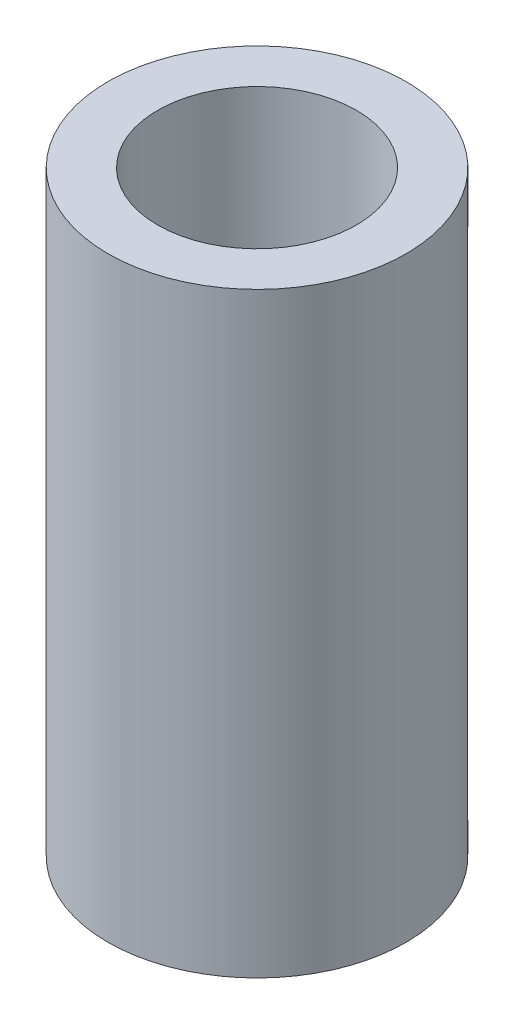
ISO-10303-21;
HEADER;
FILE_DESCRIPTION(('STEP AP214'),'2;1');
FILE_NAME('part.step','',(''),(''),'','','');
FILE_SCHEMA(('AUTOMOTIVE_DESIGN { 1 0 10303 214 1 1 1 1 }'));
ENDSEC;
DATA;
#1=APPLICATION_CONTEXT('core data for automotive mechanical design processes');
#2=APPLICATION_PROTOCOL_DEFINITION('international standard','automotive_design',2000,#1);
#3=PRODUCT_CONTEXT('',#1,'mechanical');
#4=PRODUCT('Part','Part','',(#3));
#5=PRODUCT_RELATED_PRODUCT_CATEGORY('part','',(#4));
#6=PRODUCT_DEFINITION_FORMATION('','',#4);
#7=PRODUCT_DEFINITION_CONTEXT('part definition',#1,'design');
#8=PRODUCT_DEFINITION('design','',#6,#7);
#9=PRODUCT_DEFINITION_SHAPE('','',#8);
#10=(LENGTH_UNIT() NAMED_UNIT(*) SI_UNIT(.MILLI.,.METRE.));
#11=(NAMED_UNIT(*) PLANE_ANGLE_UNIT() SI_UNIT($,.RADIAN.));
#12=(NAMED_UNIT(*) SI_UNIT($,.STERADIAN.) SOLID_ANGLE_UNIT());
#13=UNCERTAINTY_MEASURE_WITH_UNIT(LENGTH_MEASURE(1.E-05),#10,'distance_accuracy_value','');
#14=(GEOMETRIC_REPRESENTATION_CONTEXT(3) GLOBAL_UNCERTAINTY_ASSIGNED_CONTEXT((#13)) GLOBAL_UNIT_ASSIGNED_CONTEXT((#10,
#11,#12)) REPRESENTATION_CONTEXT('',''));
#15=CARTESIAN_POINT('',(0.,0.,0.));
#16=DIRECTION('',(0.,0.,1.));
#17=DIRECTION('',(1.,0.,0.));
#18=AXIS2_PLACEMENT_3D('',#15,#16,#17);
#19=CARTESIAN_POINT('',(0.,18.,0.));
#20=DIRECTION('',(0.,1.,0.));
#21=DIRECTION('',(0.,0.,1.));
#22=AXIS2_PLACEMENT_3D('',#19,#20,#21);
#23=PLANE('',#22);
#24=CARTESIAN_POINT('',(0.,18.,0.));
#25=DIRECTION('',(0.,1.,0.));
#26=DIRECTION('',(0.,0.,1.));
#27=AXIS2_PLACEMENT_3D('',#24,#25,#26);
#28=CIRCLE('',#27,4.5);
#29=CARTESIAN_POINT('',(0.,18.,4.5));
#30=VERTEX_POINT('',#29);
#31=EDGE_CURVE('E52',#30,#30,#28,.T.);
#32=ORIENTED_EDGE('',*,*,#31,.T.);
#33=EDGE_LOOP('',(#32));
#34=FACE_BOUND('',#33,.T.);
#35=CARTESIAN_POINT('',(0.,18.,0.));
#36=DIRECTION('',(0.,1.,0.));
#37=DIRECTION('',(0.,0.,1.));
#38=AXIS2_PLACEMENT_3D('',#35,#36,#37);
#39=CIRCLE('',#38,3.);
#40=CARTESIAN_POINT('',(0.,18.,3.));
#41=VERTEX_POINT('',#40);
#42=EDGE_CURVE('E60',#41,#41,#39,.T.);
#43=ORIENTED_EDGE('',*,*,#42,.F.);
#44=EDGE_LOOP('',(#43));
#45=FACE_BOUND('',#44,.T.);
#46=ADVANCED_FACE('F34',(#34,#45),#23,.T.);
#47=CARTESIAN_POINT('',(0.,0.,0.));
#48=DIRECTION('',(0.,1.,0.));
#49=DIRECTION('',(0.,0.,1.));
#50=AXIS2_PLACEMENT_3D('',#47,#48,#49);
#51=PLANE('',#50);
#52=CARTESIAN_POINT('',(0.,0.,0.));
#53=DIRECTION('',(0.,1.,0.));
#54=DIRECTION('',(0.,0.,1.));
#55=AXIS2_PLACEMENT_3D('',#52,#53,#54);
#56=CIRCLE('',#55,4.5);
#57=CARTESIAN_POINT('',(0.,0.,4.5));
#58=VERTEX_POINT('',#57);
#59=EDGE_CURVE('E67',#58,#58,#56,.T.);
#60=ORIENTED_EDGE('',*,*,#59,.F.);
#61=EDGE_LOOP('',(#60));
#62=FACE_BOUND('',#61,.T.);
#63=CARTESIAN_POINT('',(0.,0.,0.));
#64=DIRECTION('',(0.,1.,0.));
#65=DIRECTION('',(0.,0.,1.));
#66=AXIS2_PLACEMENT_3D('',#63,#64,#65);
#67=CIRCLE('',#66,3.);
#68=CARTESIAN_POINT('',(0.,0.,3.));
#69=VERTEX_POINT('',#68);
#70=EDGE_CURVE('E63',#69,#69,#67,.T.);
#71=ORIENTED_EDGE('',*,*,#70,.T.);
#72=EDGE_LOOP('',(#71));
#73=FACE_BOUND('',#72,.T.);
#74=ADVANCED_FACE('F78',(#62,#73),#51,.F.);
#75=CARTESIAN_POINT('',(0.,18.,0.));
#76=DIRECTION('',(0.,-1.,0.));
#77=DIRECTION('',(0.,0.,-1.));
#78=AXIS2_PLACEMENT_3D('',#75,#76,#77);
#79=CYLINDRICAL_SURFACE('',#78,4.5);
#80=CARTESIAN_POINT('',(0.,9.,-4.5));
#81=CARTESIAN_POINT('',(-0.15072164959947,8.99999813426493,-4.49999851870946));
#82=CARTESIAN_POINT('',(-0.301452176851333,8.98857832417678,-4.49236147696477));
#83=CARTESIAN_POINT('',(-0.59810104158593,8.94360542507381,-4.46257035096117));
#84=CARTESIAN_POINT('',(-0.74401705991098,8.91004182818988,-4.44040937470719));
#85=CARTESIAN_POINT('',(-1.02631807461021,8.82283823203407,-4.38375708578349));
#86=CARTESIAN_POINT('',(-1.16274420495288,8.76929223840315,-4.34932354201735));
#87=CARTESIAN_POINT('',(-1.42412304054445,8.64440500668519,-4.27089210854984));
#88=CARTESIAN_POINT('',(-1.54907407635533,8.57306118489946,-4.22689283031654));
#89=CARTESIAN_POINT('',(-1.7959270197585,8.40801457838083,-4.1284099283604));
#90=CARTESIAN_POINT('',(-1.91667044973221,8.31292820469136,-4.0733534604063));
#91=CARTESIAN_POINT('',(-2.14159207551014,8.10640493121269,-3.95973469954022));
#92=CARTESIAN_POINT('',(-2.24574608557945,7.99494460644394,-3.90116745629249));
#93=CARTESIAN_POINT('',(-2.45133446337936,7.73842144719105,-3.7759239690936));
#94=CARTESIAN_POINT('',(-2.54974779469906,7.59083151982669,-3.70942601877786));
#95=CARTESIAN_POINT('',(-2.72025535595352,7.2774549338977,-3.58626221058086));
#96=CARTESIAN_POINT('',(-2.79239510156523,7.11170039773947,-3.52957943938873));
#97=CARTESIAN_POINT('',(-2.8901105250523,6.81493305980811,-3.44964399957303));
#98=CARTESIAN_POINT('',(-2.92311670850673,6.68770732067158,-3.42146441836474));
#99=CARTESIAN_POINT('',(-2.97225926681176,6.42788324290506,-3.37886954491533));
#100=CARTESIAN_POINT('',(-2.9884247197938,6.29529457692171,-3.36443053119849));
#101=CARTESIAN_POINT('',(-3.002870462104,6.02778783170445,-3.35154908408425));
#102=CARTESIAN_POINT('',(-3.00107764373871,5.89286246479561,-3.35317203825297));
#103=CARTESIAN_POINT('',(-2.97956372002451,5.62554753977618,-3.37229663237604));
#104=CARTESIAN_POINT('',(-2.95982742578818,5.49316022705024,-3.3898117247656));
#105=CARTESIAN_POINT('',(-2.90497491317742,5.24029942303126,-3.43690778941067));
#106=CARTESIAN_POINT('',(-2.87057567189679,5.11955799573548,-3.46592232325882));
#107=CARTESIAN_POINT('',(-2.78805177845537,4.88546446318416,-3.53264434237926));
#108=CARTESIAN_POINT('',(-2.73992260984511,4.77211480454443,-3.57035468734855));
#109=CARTESIAN_POINT('',(-2.62010728109712,4.53146190709751,-3.65946294623512));
#110=CARTESIAN_POINT('',(-2.54562078453565,4.40601014931102,-3.7120847662621));
#111=CARTESIAN_POINT('',(-2.3800344065443,4.16792490703567,-3.82037306584868));
#112=CARTESIAN_POINT('',(-2.28891403498575,4.05530751334647,-3.8760432405953));
#113=CARTESIAN_POINT('',(-2.06971747984492,3.82118618160754,-3.9981501565101));
#114=CARTESIAN_POINT('',(-1.93790907425758,3.70299892697923,-4.06432117082282));
#115=CARTESIAN_POINT('',(-1.65301199861739,3.49020525818891,-4.18827150996376));
#116=CARTESIAN_POINT('',(-1.49994344901489,3.39557678188572,-4.24605866471716));
#117=CARTESIAN_POINT('',(-1.20728674064533,3.24978342206635,-4.33718106135825));
#118=CARTESIAN_POINT('',(-1.07093646505801,3.19373495499177,-4.37308891748384));
#119=CARTESIAN_POINT('',(-0.789054065903081,3.10184261156177,-4.43261578545673));
#120=CARTESIAN_POINT('',(-0.643529818502438,3.06598165930163,-4.45624518191295));
#121=CARTESIAN_POINT('',(-0.346478179758464,3.01625825214305,-4.48913823235232));
#122=CARTESIAN_POINT('',(-0.194927717901256,3.00249080859262,-4.49833983691785));
#123=CARTESIAN_POINT('',(0.108662279084034,2.99812936715668,-4.50124672447714));
#124=CARTESIAN_POINT('',(0.260701779279961,3.00753374926683,-4.4949530907845));
#125=CARTESIAN_POINT('',(0.549683575806331,3.04743608334294,-4.46849384136411));
#126=CARTESIAN_POINT('',(0.686936167018708,3.07640594663286,-4.44933369585341));
#127=CARTESIAN_POINT('',(0.954174588641178,3.15239352901926,-4.39977673927253));
#128=CARTESIAN_POINT('',(1.08415925635699,3.19941412639221,-4.36937813620477));
#129=CARTESIAN_POINT('',(1.34199712569868,3.31297844556749,-4.29744528793742));
#130=CARTESIAN_POINT('',(1.46924427694594,3.38053223112321,-4.255348052037));
#131=CARTESIAN_POINT('',(1.71102453593713,3.53164993491898,-4.16402783417243));
#132=CARTESIAN_POINT('',(1.82554972230581,3.61522374079664,-4.11480045605826));
#133=CARTESIAN_POINT('',(2.0577816822297,3.81091180223814,-4.00431819980243));
#134=CARTESIAN_POINT('',(2.17312781352281,3.92544939012013,-3.9423923520064));
#135=CARTESIAN_POINT('',(2.3840095210624,4.17166714492816,-3.81856759628544));
#136=CARTESIAN_POINT('',(2.479531404936,4.30335905863309,-3.75666873625294));
#137=CARTESIAN_POINT('',(2.6418716481687,4.57071361917798,-3.64409518457218));
#138=CARTESIAN_POINT('',(2.71043454162459,4.70509805028581,-3.59291395543388));
#139=CARTESIAN_POINT('',(2.82744320635816,4.98580897857312,-3.50158461394404));
#140=CARTESIAN_POINT('',(2.87592518617797,5.13211340711363,-3.46141668776782));
#141=CARTESIAN_POINT('',(2.94353765120496,5.40684673107468,-3.4039981228867));
#142=CARTESIAN_POINT('',(2.96637896084263,5.53375771577686,-3.38392497082229));
#143=CARTESIAN_POINT('',(2.99548809149845,5.79085992101578,-3.35819199607308));
#144=CARTESIAN_POINT('',(3.00177391409198,5.92104742314511,-3.35251651835367));
#145=CARTESIAN_POINT('',(2.99735881990096,6.18096458865179,-3.3564630191144));
#146=CARTESIAN_POINT('',(2.98664784488398,6.3106939353669,-3.36609405556937));
#147=CARTESIAN_POINT('',(2.94895499505287,6.56601527947414,-3.39915677908566));
#148=CARTESIAN_POINT('',(2.9219514129043,6.69160152098054,-3.42260687689844));
#149=CARTESIAN_POINT('',(2.8438953613818,6.9685668427359,-3.48790269152003));
#150=CARTESIAN_POINT('',(2.78835207942162,7.11790183368218,-3.53298514180157));
#151=CARTESIAN_POINT('',(2.65626862210843,7.40322998693671,-3.63333227844808));
#152=CARTESIAN_POINT('',(2.57969896746294,7.53920405087502,-3.68861122446522));
#153=CARTESIAN_POINT('',(2.40597141606592,7.79892384494852,-3.80425832897252));
#154=CARTESIAN_POINT('',(2.3084641330428,7.92240193767324,-3.86470080799841));
#155=CARTESIAN_POINT('',(2.09508703906085,8.15297989667609,-3.98442252534058));
#156=CARTESIAN_POINT('',(1.97921160224442,8.26007472522242,-4.04370140099277));
#157=CARTESIAN_POINT('',(1.71214106865833,8.47008447510064,-4.16448181195186));
#158=CARTESIAN_POINT('',(1.55826365805385,8.5701929232954,-4.22508104882973));
#159=CARTESIAN_POINT('',(1.31299166972122,8.69899932827404,-4.30505398282392));
#160=CARTESIAN_POINT('',(1.22882978620485,8.73837392455961,-4.32988963193168));
#161=CARTESIAN_POINT('',(1.05622318392366,8.80946645928097,-4.37519698031788));
#162=CARTESIAN_POINT('',(0.967779982313746,8.8411870865214,-4.39567021179748));
#163=CARTESIAN_POINT('',(0.737227179511888,8.91169488938088,-4.44149572508134));
#164=CARTESIAN_POINT('',(0.592538469527609,8.94465665075917,-4.4632644493173));
#165=CARTESIAN_POINT('',(0.298567051424189,8.98880194924378,-4.49251195251075));
#166=CARTESIAN_POINT('',(0.149287880489566,9.00000184798691,-4.50000146719947));
#167=CARTESIAN_POINT('',(0.,9.,-4.5));
#168=B_SPLINE_CURVE_WITH_KNOTS('',3,(#80,#81,#82,#83,#84,#85,#86,#87,#88,#89,#90,#91,#92,#93,
#94,#95,#96,#97,#98,#99,#100,#101,#102,#103,#104,#105,#106,#107,#108,#109,#110,#111,#112,#113,
#114,#115,#116,#117,#118,#119,#120,#121,#122,#123,#124,#125,#126,#127,#128,#129,#130,#131,#132,
#133,#134,#135,#136,#137,#138,#139,#140,#141,#142,#143,#144,#145,#146,#147,#148,#149,#150,#151,
#152,#153,#154,#155,#156,#157,#158,#159,#160,#161,#162,#163,#164,#165,#166,#167),.UNSPECIFIED.,
.T.,.F.,(4,2,2,2,2,2,2,2,2,2,2,2,2,2,2,2,2,2,2,2,2,2,2,2,2,2,2,2,2,2,2,2,2,2,2,2,2,2,2,2,2,2,2,
4),(0.,0.451579839758099,0.903374121523032,1.35306922978535,1.8028296580108,2.29075543500835,
2.77938617406478,3.34510024943974,3.90982958168158,4.31150540514044,4.71248651768713,
5.11510067603067,5.51805595895028,5.90323293302503,6.28853675717404,6.75221362001097,
7.21646555679872,7.78078431754915,8.3445726046183,8.79786131554924,9.25076602724006,
9.70561324951163,10.1604286730991,10.583296271985,11.0062313271719,11.4547852025406,
11.9036168242759,12.4234226422172,12.9435862977342,13.419749029665,13.8950493997087,
14.2848607203399,14.6742480050942,15.0638658043661,15.4540038578839,15.9480991306608,
16.4428907007672,16.9466886781651,17.4506412596501,18.0269302733762,18.3150447812807,
18.603057928026,19.0506787001148,19.4979627985071),.UNSPECIFIED.);
#169=CARTESIAN_POINT('',(0.,9.,-4.5));
#170=VERTEX_POINT('',#169);
#171=EDGE_CURVE('E65',#170,#170,#168,.T.);
#172=ORIENTED_EDGE('',*,*,#171,.T.);
#173=EDGE_LOOP('',(#172));
#174=FACE_BOUND('',#173,.T.);
#175=ORIENTED_EDGE('',*,*,#31,.F.);
#176=EDGE_LOOP('',(#175));
#177=FACE_BOUND('',#176,.T.);
#178=ORIENTED_EDGE('',*,*,#59,.T.);
#179=EDGE_LOOP('',(#178));
#180=FACE_BOUND('',#179,.T.);
#181=ADVANCED_FACE('F36',(#174,#177,#180),#79,.T.);
#182=CARTESIAN_POINT('',(0.,18.,0.));
#183=DIRECTION('',(0.,-1.,0.));
#184=DIRECTION('',(0.,0.,-1.));
#185=AXIS2_PLACEMENT_3D('',#182,#183,#184);
#186=CYLINDRICAL_SURFACE('',#185,3.);
#187=CARTESIAN_POINT('',(0.,6.,0.));
#188=DIRECTION('',(0.,-0.707106781186547,0.707106781186547));
#189=DIRECTION('',(0.,-0.707106781186547,-0.707106781186547));
#190=AXIS2_PLACEMENT_3D('',#187,#188,#189);
#191=ELLIPSE('',#190,4.24264068711928,3.);
#192=CARTESIAN_POINT('',(-3.,6.,0.));
#193=VERTEX_POINT('',#192);
#194=CARTESIAN_POINT('',(3.,6.,0.));
#195=VERTEX_POINT('',#194);
#196=EDGE_CURVE('E11',#193,#195,#191,.T.);
#197=ORIENTED_EDGE('',*,*,#196,.F.);
#198=CARTESIAN_POINT('',(0.,6.,0.));
#199=DIRECTION('',(0.,-0.707106781186547,-0.707106781186547));
#200=DIRECTION('',(0.,-0.707106781186547,0.707106781186547));
#201=AXIS2_PLACEMENT_3D('',#198,#199,#200);
#202=ELLIPSE('',#201,4.24264068711928,3.);
#203=EDGE_CURVE('E43',#195,#193,#202,.F.);
#204=ORIENTED_EDGE('',*,*,#203,.F.);
#205=EDGE_LOOP('',(#197,#204));
#206=FACE_BOUND('',#205,.T.);
#207=ORIENTED_EDGE('',*,*,#42,.T.);
#208=EDGE_LOOP('',(#207));
#209=FACE_BOUND('',#208,.T.);
#210=ORIENTED_EDGE('',*,*,#70,.F.);
#211=EDGE_LOOP('',(#210));
#212=FACE_BOUND('',#211,.T.);
#213=ADVANCED_FACE('F53',(#206,#209,#212),#186,.F.);
#214=CARTESIAN_POINT('',(0.,6.,-4.5));
#215=DIRECTION('',(0.,0.,1.));
#216=DIRECTION('',(1.,0.,0.));
#217=AXIS2_PLACEMENT_3D('',#214,#215,#216);
#218=CYLINDRICAL_SURFACE('',#217,3.);
#219=ORIENTED_EDGE('',*,*,#196,.T.);
#220=ORIENTED_EDGE('',*,*,#203,.T.);
#221=EDGE_LOOP('',(#219,#220));
#222=FACE_BOUND('',#221,.T.);
#223=ORIENTED_EDGE('',*,*,#171,.F.);
#224=EDGE_LOOP('',(#223));
#225=FACE_BOUND('',#224,.T.);
#226=ADVANCED_FACE('F49',(#222,#225),#218,.F.);
#227=CLOSED_SHELL('',(#46,#74,#181,#213,#226));
#228=MANIFOLD_SOLID_BREP('B2',#227);
#229=ADVANCED_BREP_SHAPE_REPRESENTATION('',(#18,#228),#14);
#230=SHAPE_DEFINITION_REPRESENTATION(#9,#229);
ENDSEC;
END-ISO-10303-21;
